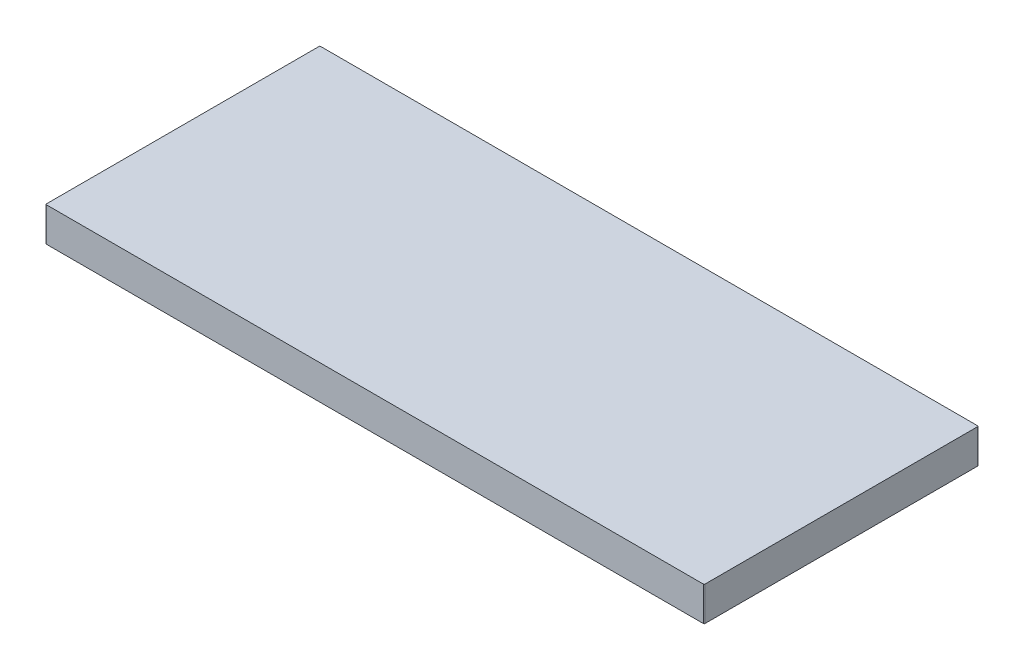
ISO-10303-21;
HEADER;
FILE_DESCRIPTION(('STEP AP214'),'2;1');
FILE_NAME('part.step','',(''),(''),'','','');
FILE_SCHEMA(('AUTOMOTIVE_DESIGN { 1 0 10303 214 1 1 1 1 }'));
ENDSEC;
DATA;
#1=APPLICATION_CONTEXT('core data for automotive mechanical design processes');
#2=APPLICATION_PROTOCOL_DEFINITION('international standard','automotive_design',2000,#1);
#3=PRODUCT_CONTEXT('',#1,'mechanical');
#4=PRODUCT('Part','Part','',(#3));
#5=PRODUCT_RELATED_PRODUCT_CATEGORY('part','',(#4));
#6=PRODUCT_DEFINITION_FORMATION('','',#4);
#7=PRODUCT_DEFINITION_CONTEXT('part definition',#1,'design');
#8=PRODUCT_DEFINITION('design','',#6,#7);
#9=PRODUCT_DEFINITION_SHAPE('','',#8);
#10=(LENGTH_UNIT() NAMED_UNIT(*) SI_UNIT(.MILLI.,.METRE.));
#11=(NAMED_UNIT(*) PLANE_ANGLE_UNIT() SI_UNIT($,.RADIAN.));
#12=(NAMED_UNIT(*) SI_UNIT($,.STERADIAN.) SOLID_ANGLE_UNIT());
#13=UNCERTAINTY_MEASURE_WITH_UNIT(LENGTH_MEASURE(1.E-05),#10,'distance_accuracy_value','');
#14=(GEOMETRIC_REPRESENTATION_CONTEXT(3) GLOBAL_UNCERTAINTY_ASSIGNED_CONTEXT((#13)) GLOBAL_UNIT_ASSIGNED_CONTEXT((#10,
#11,#12)) REPRESENTATION_CONTEXT('',''));
#15=CARTESIAN_POINT('',(0.,0.,0.));
#16=DIRECTION('',(0.,0.,1.));
#17=DIRECTION('',(1.,0.,0.));
#18=AXIS2_PLACEMENT_3D('',#15,#16,#17);
#19=CARTESIAN_POINT('',(48.05,5.,19.95));
#20=DIRECTION('',(0.,-1.,0.));
#21=DIRECTION('',(0.,0.,-1.));
#22=AXIS2_PLACEMENT_3D('',#19,#20,#21);
#23=CYLINDRICAL_SURFACE('',#22,0.100000000000001);
#24=CARTESIAN_POINT('',(48.05,0.,19.95));
#25=DIRECTION('',(0.,1.,0.));
#26=DIRECTION('',(0.,0.,1.));
#27=AXIS2_PLACEMENT_3D('',#24,#25,#26);
#28=CIRCLE('',#27,0.100000000000001);
#29=CARTESIAN_POINT('',(48.05,0.,20.05));
#30=VERTEX_POINT('',#29);
#31=CARTESIAN_POINT('',(48.15,0.,19.95));
#32=VERTEX_POINT('',#31);
#33=EDGE_CURVE('E128',#30,#32,#28,.T.);
#34=ORIENTED_EDGE('',*,*,#33,.T.);
#35=DIRECTION('',(0.,-1.,0.));
#36=VECTOR('',#35,1.);
#37=CARTESIAN_POINT('',(48.15,5.,19.95));
#38=LINE('',#37,#36);
#39=CARTESIAN_POINT('',(48.15,5.,19.95));
#40=VERTEX_POINT('',#39);
#41=EDGE_CURVE('E11',#40,#32,#38,.T.);
#42=ORIENTED_EDGE('',*,*,#41,.F.);
#43=CARTESIAN_POINT('',(48.05,5.,19.95));
#44=DIRECTION('',(0.,1.,0.));
#45=DIRECTION('',(0.,0.,1.));
#46=AXIS2_PLACEMENT_3D('',#43,#44,#45);
#47=CIRCLE('',#46,0.100000000000001);
#48=CARTESIAN_POINT('',(48.05,5.,20.05));
#49=VERTEX_POINT('',#48);
#50=EDGE_CURVE('E142',#49,#40,#47,.T.);
#51=ORIENTED_EDGE('',*,*,#50,.F.);
#52=DIRECTION('',(0.,-1.,0.));
#53=VECTOR('',#52,1.);
#54=CARTESIAN_POINT('',(48.05,5.,20.05));
#55=LINE('',#54,#53);
#56=EDGE_CURVE('E124',#49,#30,#55,.T.);
#57=ORIENTED_EDGE('',*,*,#56,.T.);
#58=EDGE_LOOP('',(#34,#42,#51,#57));
#59=FACE_BOUND('',#58,.T.);
#60=ADVANCED_FACE('F32',(#59),#23,.T.);
#61=CARTESIAN_POINT('',(48.15,5.,19.95));
#62=DIRECTION('',(-1.,0.,0.));
#63=DIRECTION('',(0.,0.,1.));
#64=AXIS2_PLACEMENT_3D('',#61,#62,#63);
#65=PLANE('',#64);
#66=DIRECTION('',(0.,0.,-1.));
#67=VECTOR('',#66,1.);
#68=CARTESIAN_POINT('',(48.15,0.,19.95));
#69=LINE('',#68,#67);
#70=CARTESIAN_POINT('',(48.15,0.,-19.95));
#71=VERTEX_POINT('',#70);
#72=EDGE_CURVE('E131',#32,#71,#69,.T.);
#73=ORIENTED_EDGE('',*,*,#72,.T.);
#74=DIRECTION('',(0.,-1.,0.));
#75=VECTOR('',#74,1.);
#76=CARTESIAN_POINT('',(48.15,5.,-19.95));
#77=LINE('',#76,#75);
#78=CARTESIAN_POINT('',(48.15,5.,-19.95));
#79=VERTEX_POINT('',#78);
#80=EDGE_CURVE('E40',#79,#71,#77,.T.);
#81=ORIENTED_EDGE('',*,*,#80,.F.);
#82=DIRECTION('',(0.,0.,-1.));
#83=VECTOR('',#82,1.);
#84=CARTESIAN_POINT('',(48.15,5.,19.95));
#85=LINE('',#84,#83);
#86=EDGE_CURVE('E91',#40,#79,#85,.T.);
#87=ORIENTED_EDGE('',*,*,#86,.F.);
#88=ORIENTED_EDGE('',*,*,#41,.T.);
#89=EDGE_LOOP('',(#73,#81,#87,#88));
#90=FACE_BOUND('',#89,.T.);
#91=ADVANCED_FACE('F177',(#90),#65,.F.);
#92=CARTESIAN_POINT('',(48.05,5.,-19.95));
#93=DIRECTION('',(0.,-1.,0.));
#94=DIRECTION('',(0.,0.,-1.));
#95=AXIS2_PLACEMENT_3D('',#92,#93,#94);
#96=CYLINDRICAL_SURFACE('',#95,0.100000000000001);
#97=CARTESIAN_POINT('',(48.05,0.,-19.95));
#98=DIRECTION('',(0.,1.,0.));
#99=DIRECTION('',(0.,0.,1.));
#100=AXIS2_PLACEMENT_3D('',#97,#98,#99);
#101=CIRCLE('',#100,0.100000000000001);
#102=CARTESIAN_POINT('',(48.05,0.,-20.05));
#103=VERTEX_POINT('',#102);
#104=EDGE_CURVE('E133',#71,#103,#101,.T.);
#105=ORIENTED_EDGE('',*,*,#104,.T.);
#106=DIRECTION('',(0.,-1.,0.));
#107=VECTOR('',#106,1.);
#108=CARTESIAN_POINT('',(48.05,5.,-20.05));
#109=LINE('',#108,#107);
#110=CARTESIAN_POINT('',(48.05,5.,-20.05));
#111=VERTEX_POINT('',#110);
#112=EDGE_CURVE('E149',#111,#103,#109,.T.);
#113=ORIENTED_EDGE('',*,*,#112,.F.);
#114=CARTESIAN_POINT('',(48.05,5.,-19.95));
#115=DIRECTION('',(0.,1.,0.));
#116=DIRECTION('',(0.,0.,1.));
#117=AXIS2_PLACEMENT_3D('',#114,#115,#116);
#118=CIRCLE('',#117,0.100000000000001);
#119=EDGE_CURVE('E157',#79,#111,#118,.T.);
#120=ORIENTED_EDGE('',*,*,#119,.F.);
#121=ORIENTED_EDGE('',*,*,#80,.T.);
#122=EDGE_LOOP('',(#105,#113,#120,#121));
#123=FACE_BOUND('',#122,.T.);
#124=ADVANCED_FACE('F155',(#123),#96,.T.);
#125=CARTESIAN_POINT('',(48.05,5.,-20.05));
#126=DIRECTION('',(0.,0.,1.));
#127=DIRECTION('',(1.,0.,0.));
#128=AXIS2_PLACEMENT_3D('',#125,#126,#127);
#129=PLANE('',#128);
#130=DIRECTION('',(-1.,0.,0.));
#131=VECTOR('',#130,1.);
#132=CARTESIAN_POINT('',(48.05,0.,-20.05));
#133=LINE('',#132,#131);
#134=CARTESIAN_POINT('',(-48.05,0.,-20.05));
#135=VERTEX_POINT('',#134);
#136=EDGE_CURVE('E135',#103,#135,#133,.T.);
#137=ORIENTED_EDGE('',*,*,#136,.T.);
#138=DIRECTION('',(0.,-1.,0.));
#139=VECTOR('',#138,1.);
#140=CARTESIAN_POINT('',(-48.05,5.,-20.05));
#141=LINE('',#140,#139);
#142=CARTESIAN_POINT('',(-48.05,5.,-20.05));
#143=VERTEX_POINT('',#142);
#144=EDGE_CURVE('E146',#143,#135,#141,.T.);
#145=ORIENTED_EDGE('',*,*,#144,.F.);
#146=DIRECTION('',(-1.,0.,0.));
#147=VECTOR('',#146,1.);
#148=CARTESIAN_POINT('',(48.05,5.,-20.05));
#149=LINE('',#148,#147);
#150=EDGE_CURVE('E169',#111,#143,#149,.T.);
#151=ORIENTED_EDGE('',*,*,#150,.F.);
#152=ORIENTED_EDGE('',*,*,#112,.T.);
#153=EDGE_LOOP('',(#137,#145,#151,#152));
#154=FACE_BOUND('',#153,.T.);
#155=ADVANCED_FACE('F165',(#154),#129,.F.);
#156=CARTESIAN_POINT('',(-48.05,5.,-19.95));
#157=DIRECTION('',(0.,-1.,0.));
#158=DIRECTION('',(0.,0.,-1.));
#159=AXIS2_PLACEMENT_3D('',#156,#157,#158);
#160=CYLINDRICAL_SURFACE('',#159,0.0999999999999994);
#161=CARTESIAN_POINT('',(-48.05,0.,-19.95));
#162=DIRECTION('',(0.,1.,0.));
#163=DIRECTION('',(0.,0.,1.));
#164=AXIS2_PLACEMENT_3D('',#161,#162,#163);
#165=CIRCLE('',#164,0.0999999999999994);
#166=CARTESIAN_POINT('',(-48.15,0.,-19.95));
#167=VERTEX_POINT('',#166);
#168=EDGE_CURVE('E137',#135,#167,#165,.T.);
#169=ORIENTED_EDGE('',*,*,#168,.T.);
#170=DIRECTION('',(0.,-1.,0.));
#171=VECTOR('',#170,1.);
#172=CARTESIAN_POINT('',(-48.15,5.,-19.95));
#173=LINE('',#172,#171);
#174=CARTESIAN_POINT('',(-48.15,5.,-19.95));
#175=VERTEX_POINT('',#174);
#176=EDGE_CURVE('E119',#175,#167,#173,.T.);
#177=ORIENTED_EDGE('',*,*,#176,.F.);
#178=CARTESIAN_POINT('',(-48.05,5.,-19.95));
#179=DIRECTION('',(0.,1.,0.));
#180=DIRECTION('',(0.,0.,1.));
#181=AXIS2_PLACEMENT_3D('',#178,#179,#180);
#182=CIRCLE('',#181,0.0999999999999994);
#183=EDGE_CURVE('E110',#143,#175,#182,.T.);
#184=ORIENTED_EDGE('',*,*,#183,.F.);
#185=ORIENTED_EDGE('',*,*,#144,.T.);
#186=EDGE_LOOP('',(#169,#177,#184,#185));
#187=FACE_BOUND('',#186,.T.);
#188=ADVANCED_FACE('F168',(#187),#160,.T.);
#189=CARTESIAN_POINT('',(-48.15,5.,-19.95));
#190=DIRECTION('',(1.,0.,0.));
#191=DIRECTION('',(0.,0.,-1.));
#192=AXIS2_PLACEMENT_3D('',#189,#190,#191);
#193=PLANE('',#192);
#194=DIRECTION('',(0.,0.,1.));
#195=VECTOR('',#194,1.);
#196=CARTESIAN_POINT('',(-48.15,0.,-19.95));
#197=LINE('',#196,#195);
#198=CARTESIAN_POINT('',(-48.15,0.,19.95));
#199=VERTEX_POINT('',#198);
#200=EDGE_CURVE('E118',#167,#199,#197,.T.);
#201=ORIENTED_EDGE('',*,*,#200,.T.);
#202=DIRECTION('',(0.,-1.,0.));
#203=VECTOR('',#202,1.);
#204=CARTESIAN_POINT('',(-48.15,5.,19.95));
#205=LINE('',#204,#203);
#206=CARTESIAN_POINT('',(-48.15,5.,19.95));
#207=VERTEX_POINT('',#206);
#208=EDGE_CURVE('E115',#207,#199,#205,.T.);
#209=ORIENTED_EDGE('',*,*,#208,.F.);
#210=DIRECTION('',(0.,0.,1.));
#211=VECTOR('',#210,1.);
#212=CARTESIAN_POINT('',(-48.15,5.,-19.95));
#213=LINE('',#212,#211);
#214=EDGE_CURVE('E104',#175,#207,#213,.T.);
#215=ORIENTED_EDGE('',*,*,#214,.F.);
#216=ORIENTED_EDGE('',*,*,#176,.T.);
#217=EDGE_LOOP('',(#201,#209,#215,#216));
#218=FACE_BOUND('',#217,.T.);
#219=ADVANCED_FACE('F116',(#218),#193,.F.);
#220=CARTESIAN_POINT('',(-48.05,5.,19.95));
#221=DIRECTION('',(0.,-1.,0.));
#222=DIRECTION('',(0.,0.,-1.));
#223=AXIS2_PLACEMENT_3D('',#220,#221,#222);
#224=CYLINDRICAL_SURFACE('',#223,0.100000000000001);
#225=CARTESIAN_POINT('',(-48.05,0.,19.95));
#226=DIRECTION('',(0.,1.,0.));
#227=DIRECTION('',(0.,0.,1.));
#228=AXIS2_PLACEMENT_3D('',#225,#226,#227);
#229=CIRCLE('',#228,0.100000000000001);
#230=CARTESIAN_POINT('',(-48.05,0.,20.05));
#231=VERTEX_POINT('',#230);
#232=EDGE_CURVE('E77',#199,#231,#229,.T.);
#233=ORIENTED_EDGE('',*,*,#232,.T.);
#234=DIRECTION('',(0.,-1.,0.));
#235=VECTOR('',#234,1.);
#236=CARTESIAN_POINT('',(-48.05,5.,20.05));
#237=LINE('',#236,#235);
#238=CARTESIAN_POINT('',(-48.05,5.,20.05));
#239=VERTEX_POINT('',#238);
#240=EDGE_CURVE('E120',#239,#231,#237,.T.);
#241=ORIENTED_EDGE('',*,*,#240,.F.);
#242=CARTESIAN_POINT('',(-48.05,5.,19.95));
#243=DIRECTION('',(0.,1.,0.));
#244=DIRECTION('',(0.,0.,1.));
#245=AXIS2_PLACEMENT_3D('',#242,#243,#244);
#246=CIRCLE('',#245,0.100000000000001);
#247=EDGE_CURVE('E108',#207,#239,#246,.T.);
#248=ORIENTED_EDGE('',*,*,#247,.F.);
#249=ORIENTED_EDGE('',*,*,#208,.T.);
#250=EDGE_LOOP('',(#233,#241,#248,#249));
#251=FACE_BOUND('',#250,.T.);
#252=ADVANCED_FACE('F122',(#251),#224,.T.);
#253=CARTESIAN_POINT('',(-48.05,5.,20.05));
#254=DIRECTION('',(0.,0.,-1.));
#255=DIRECTION('',(-1.,0.,0.));
#256=AXIS2_PLACEMENT_3D('',#253,#254,#255);
#257=PLANE('',#256);
#258=DIRECTION('',(1.,0.,0.));
#259=VECTOR('',#258,1.);
#260=CARTESIAN_POINT('',(-48.05,0.,20.05));
#261=LINE('',#260,#259);
#262=EDGE_CURVE('E83',#231,#30,#261,.T.);
#263=ORIENTED_EDGE('',*,*,#262,.T.);
#264=ORIENTED_EDGE('',*,*,#56,.F.);
#265=DIRECTION('',(1.,0.,0.));
#266=VECTOR('',#265,1.);
#267=CARTESIAN_POINT('',(-48.05,5.,20.05));
#268=LINE('',#267,#266);
#269=EDGE_CURVE('E48',#239,#49,#268,.T.);
#270=ORIENTED_EDGE('',*,*,#269,.F.);
#271=ORIENTED_EDGE('',*,*,#240,.T.);
#272=EDGE_LOOP('',(#263,#264,#270,#271));
#273=FACE_BOUND('',#272,.T.);
#274=ADVANCED_FACE('F193',(#273),#257,.F.);
#275=CARTESIAN_POINT('',(48.05,5.,19.95));
#276=DIRECTION('',(0.,1.,0.));
#277=DIRECTION('',(0.,0.,1.));
#278=AXIS2_PLACEMENT_3D('',#275,#276,#277);
#279=PLANE('',#278);
#280=ORIENTED_EDGE('',*,*,#50,.T.);
#281=ORIENTED_EDGE('',*,*,#86,.T.);
#282=ORIENTED_EDGE('',*,*,#119,.T.);
#283=ORIENTED_EDGE('',*,*,#150,.T.);
#284=ORIENTED_EDGE('',*,*,#183,.T.);
#285=ORIENTED_EDGE('',*,*,#214,.T.);
#286=ORIENTED_EDGE('',*,*,#247,.T.);
#287=ORIENTED_EDGE('',*,*,#269,.T.);
#288=EDGE_LOOP('',(#280,#281,#282,#283,#284,#285,#286,#287));
#289=FACE_BOUND('',#288,.T.);
#290=ADVANCED_FACE('F106',(#289),#279,.T.);
#291=CARTESIAN_POINT('',(48.05,0.,19.95));
#292=DIRECTION('',(0.,1.,0.));
#293=DIRECTION('',(0.,0.,1.));
#294=AXIS2_PLACEMENT_3D('',#291,#292,#293);
#295=PLANE('',#294);
#296=ORIENTED_EDGE('',*,*,#33,.F.);
#297=ORIENTED_EDGE('',*,*,#262,.F.);
#298=ORIENTED_EDGE('',*,*,#232,.F.);
#299=ORIENTED_EDGE('',*,*,#200,.F.);
#300=ORIENTED_EDGE('',*,*,#168,.F.);
#301=ORIENTED_EDGE('',*,*,#136,.F.);
#302=ORIENTED_EDGE('',*,*,#104,.F.);
#303=ORIENTED_EDGE('',*,*,#72,.F.);
#304=EDGE_LOOP('',(#296,#297,#298,#299,#300,#301,#302,#303));
#305=FACE_BOUND('',#304,.T.);
#306=ADVANCED_FACE('F161',(#305),#295,.F.);
#307=CLOSED_SHELL('',(#60,#91,#124,#155,#188,#219,#252,#274,#290,#306));
#308=MANIFOLD_SOLID_BREP('B2',#307);
#309=ADVANCED_BREP_SHAPE_REPRESENTATION('',(#18,#308),#14);
#310=SHAPE_DEFINITION_REPRESENTATION(#9,#309);
ENDSEC;
END-ISO-10303-21;
